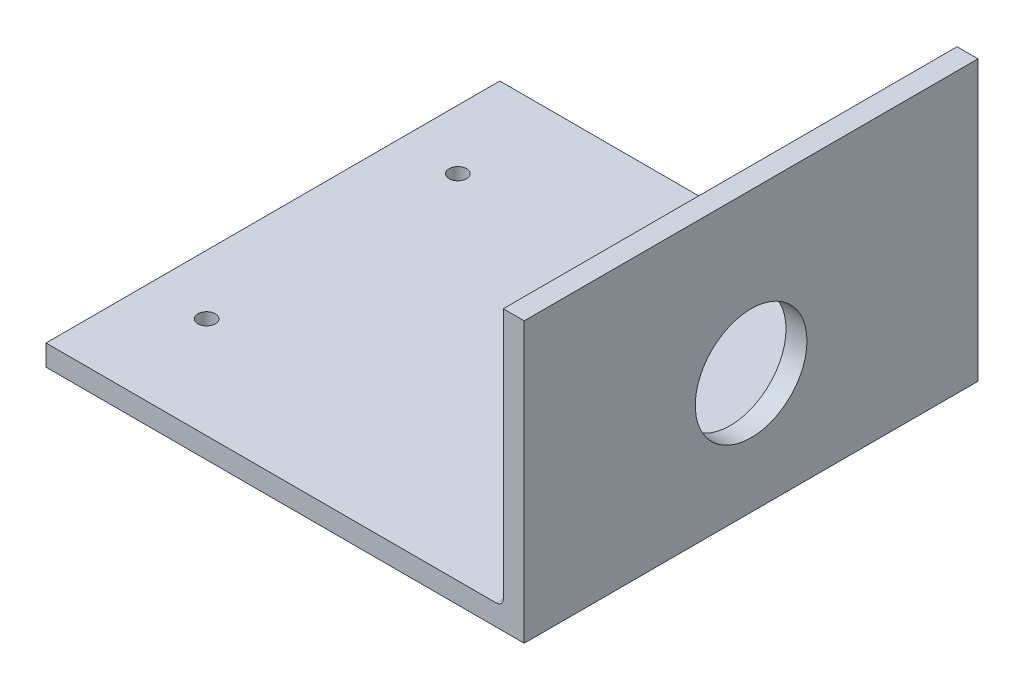
ISO-10303-21;
HEADER;
FILE_DESCRIPTION(('STEP AP214'),'2;1');
FILE_NAME('part.step','',(''),(''),'','','');
FILE_SCHEMA(('AUTOMOTIVE_DESIGN { 1 0 10303 214 1 1 1 1 }'));
ENDSEC;
DATA;
#1=APPLICATION_CONTEXT('core data for automotive mechanical design processes');
#2=APPLICATION_PROTOCOL_DEFINITION('international standard','automotive_design',2000,#1);
#3=PRODUCT_CONTEXT('',#1,'mechanical');
#4=PRODUCT('Part','Part','',(#3));
#5=PRODUCT_RELATED_PRODUCT_CATEGORY('part','',(#4));
#6=PRODUCT_DEFINITION_FORMATION('','',#4);
#7=PRODUCT_DEFINITION_CONTEXT('part definition',#1,'design');
#8=PRODUCT_DEFINITION('design','',#6,#7);
#9=PRODUCT_DEFINITION_SHAPE('','',#8);
#10=(LENGTH_UNIT() NAMED_UNIT(*) SI_UNIT(.MILLI.,.METRE.));
#11=(NAMED_UNIT(*) PLANE_ANGLE_UNIT() SI_UNIT($,.RADIAN.));
#12=(NAMED_UNIT(*) SI_UNIT($,.STERADIAN.) SOLID_ANGLE_UNIT());
#13=UNCERTAINTY_MEASURE_WITH_UNIT(LENGTH_MEASURE(1.E-05),#10,'distance_accuracy_value','');
#14=(GEOMETRIC_REPRESENTATION_CONTEXT(3) GLOBAL_UNCERTAINTY_ASSIGNED_CONTEXT((#13)) GLOBAL_UNIT_ASSIGNED_CONTEXT((#10,
#11,#12)) REPRESENTATION_CONTEXT('',''));
#15=CARTESIAN_POINT('',(0.,0.,0.));
#16=DIRECTION('',(0.,0.,1.));
#17=DIRECTION('',(1.,0.,0.));
#18=AXIS2_PLACEMENT_3D('',#15,#16,#17);
#19=CARTESIAN_POINT('',(0.,860.629465365196,0.));
#20=DIRECTION('',(0.,-1.,0.));
#21=DIRECTION('',(0.,0.,-1.));
#22=AXIS2_PLACEMENT_3D('',#19,#20,#21);
#23=PLANE('',#22);
#24=CARTESIAN_POINT('',(709.231990877992,860.629465365196,1291.3328662841));
#25=DIRECTION('',(0.,-1.,0.));
#26=DIRECTION('',(0.,0.,-1.));
#27=AXIS2_PLACEMENT_3D('',#24,#25,#26);
#28=CIRCLE('',#27,1.24999999999997);
#29=CARTESIAN_POINT('',(709.231990877992,860.629465365196,1290.0828662841));
#30=VERTEX_POINT('',#29);
#31=EDGE_CURVE('E148',#30,#30,#28,.T.);
#32=ORIENTED_EDGE('',*,*,#31,.F.);
#33=EDGE_LOOP('',(#32));
#34=FACE_BOUND('',#33,.T.);
#35=CARTESIAN_POINT('',(661.231990877992,860.629465365196,1327.3328662841));
#36=DIRECTION('',(0.,-1.,0.));
#37=DIRECTION('',(0.,0.,-1.));
#38=AXIS2_PLACEMENT_3D('',#35,#36,#37);
#39=CIRCLE('',#38,1.24999999999997);
#40=CARTESIAN_POINT('',(661.231990877992,860.629465365196,1326.0828662841));
#41=VERTEX_POINT('',#40);
#42=EDGE_CURVE('E164',#41,#41,#39,.T.);
#43=ORIENTED_EDGE('',*,*,#42,.F.);
#44=EDGE_LOOP('',(#43));
#45=FACE_BOUND('',#44,.T.);
#46=DIRECTION('',(1.,0.,0.));
#47=VECTOR('',#46,1.);
#48=CARTESIAN_POINT('',(652.731990877992,860.629465365196,1276.8328662841));
#49=LINE('',#48,#47);
#50=CARTESIAN_POINT('',(652.731990877992,860.629465365196,1276.8328662841));
#51=VERTEX_POINT('',#50);
#52=CARTESIAN_POINT('',(721.231990877992,860.629465365196,1276.8328662841));
#53=VERTEX_POINT('',#52);
#54=EDGE_CURVE('E179',#51,#53,#49,.T.);
#55=ORIENTED_EDGE('',*,*,#54,.T.);
#56=DIRECTION('',(0.,0.,-1.));
#57=VECTOR('',#56,1.);
#58=CARTESIAN_POINT('',(721.231990877992,860.629465365196,1381.98569930993));
#59=LINE('',#58,#57);
#60=CARTESIAN_POINT('',(721.231990877992,860.629465365196,1341.8328662841));
#61=VERTEX_POINT('',#60);
#62=EDGE_CURVE('E132',#61,#53,#59,.T.);
#63=ORIENTED_EDGE('',*,*,#62,.F.);
#64=DIRECTION('',(-1.,0.,0.));
#65=VECTOR('',#64,1.);
#66=CARTESIAN_POINT('',(652.731990877992,860.629465365196,1341.8328662841));
#67=LINE('',#66,#65);
#68=CARTESIAN_POINT('',(652.731990877992,860.629465365196,1341.8328662841));
#69=VERTEX_POINT('',#68);
#70=EDGE_CURVE('E172',#61,#69,#67,.T.);
#71=ORIENTED_EDGE('',*,*,#70,.T.);
#72=DIRECTION('',(0.,0.,-1.));
#73=VECTOR('',#72,1.);
#74=CARTESIAN_POINT('',(652.731990877992,860.629465365196,1341.8328662841));
#75=LINE('',#74,#73);
#76=EDGE_CURVE('E175',#69,#51,#75,.T.);
#77=ORIENTED_EDGE('',*,*,#76,.T.);
#78=EDGE_LOOP('',(#55,#63,#71,#77));
#79=FACE_BOUND('',#78,.T.);
#80=CARTESIAN_POINT('',(661.231990877992,860.629465365196,1291.3328662841));
#81=DIRECTION('',(0.,-1.,0.));
#82=DIRECTION('',(0.,0.,-1.));
#83=AXIS2_PLACEMENT_3D('',#80,#81,#82);
#84=CIRCLE('',#83,1.24999999999997);
#85=CARTESIAN_POINT('',(661.231990877992,860.629465365196,1290.0828662841));
#86=VERTEX_POINT('',#85);
#87=EDGE_CURVE('E156',#86,#86,#84,.T.);
#88=ORIENTED_EDGE('',*,*,#87,.F.);
#89=EDGE_LOOP('',(#88));
#90=FACE_BOUND('',#89,.T.);
#91=CARTESIAN_POINT('',(709.231990877992,860.629465365196,1327.3328662841));
#92=DIRECTION('',(0.,-1.,0.));
#93=DIRECTION('',(0.,0.,-1.));
#94=AXIS2_PLACEMENT_3D('',#91,#92,#93);
#95=CIRCLE('',#94,1.24999999999997);
#96=CARTESIAN_POINT('',(709.231990877992,860.629465365196,1326.0828662841));
#97=VERTEX_POINT('',#96);
#98=EDGE_CURVE('E138',#97,#97,#95,.T.);
#99=ORIENTED_EDGE('',*,*,#98,.F.);
#100=EDGE_LOOP('',(#99));
#101=FACE_BOUND('',#100,.T.);
#102=ADVANCED_FACE('F47',(#34,#45,#79,#90,#101),#23,.T.);
#103=CARTESIAN_POINT('',(0.,863.629465365196,0.));
#104=DIRECTION('',(0.,-1.,0.));
#105=DIRECTION('',(0.,0.,-1.));
#106=AXIS2_PLACEMENT_3D('',#103,#104,#105);
#107=PLANE('',#106);
#108=DIRECTION('',(-1.,0.,0.));
#109=VECTOR('',#108,1.);
#110=CARTESIAN_POINT('',(652.731990877992,863.629465365196,1341.8328662841));
#111=LINE('',#110,#109);
#112=CARTESIAN_POINT('',(717.231990877992,863.629465365196,1341.8328662841));
#113=VERTEX_POINT('',#112);
#114=CARTESIAN_POINT('',(652.731990877992,863.629465365196,1341.8328662841));
#115=VERTEX_POINT('',#114);
#116=EDGE_CURVE('E168',#113,#115,#111,.T.);
#117=ORIENTED_EDGE('',*,*,#116,.F.);
#118=DIRECTION('',(0.,0.,-1.));
#119=VECTOR('',#118,1.);
#120=CARTESIAN_POINT('',(717.231990877992,863.629465365196,0.));
#121=LINE('',#120,#119);
#122=CARTESIAN_POINT('',(717.231990877992,863.629465365196,1276.8328662841));
#123=VERTEX_POINT('',#122);
#124=EDGE_CURVE('E197',#113,#123,#121,.T.);
#125=ORIENTED_EDGE('',*,*,#124,.T.);
#126=DIRECTION('',(1.,0.,0.));
#127=VECTOR('',#126,1.);
#128=CARTESIAN_POINT('',(652.731990877992,863.629465365196,1276.8328662841));
#129=LINE('',#128,#127);
#130=CARTESIAN_POINT('',(652.731990877992,863.629465365196,1276.8328662841));
#131=VERTEX_POINT('',#130);
#132=EDGE_CURVE('E176',#131,#123,#129,.T.);
#133=ORIENTED_EDGE('',*,*,#132,.F.);
#134=DIRECTION('',(0.,0.,-1.));
#135=VECTOR('',#134,1.);
#136=CARTESIAN_POINT('',(652.731990877992,863.629465365196,1341.8328662841));
#137=LINE('',#136,#135);
#138=EDGE_CURVE('E185',#115,#131,#137,.T.);
#139=ORIENTED_EDGE('',*,*,#138,.F.);
#140=EDGE_LOOP('',(#117,#125,#133,#139));
#141=FACE_BOUND('',#140,.T.);
#142=CARTESIAN_POINT('',(661.231990877992,863.629465365196,1327.3328662841));
#143=DIRECTION('',(0.,-1.,0.));
#144=DIRECTION('',(0.,0.,-1.));
#145=AXIS2_PLACEMENT_3D('',#142,#143,#144);
#146=CIRCLE('',#145,1.24999999999997);
#147=CARTESIAN_POINT('',(661.231990877992,863.629465365196,1326.0828662841));
#148=VERTEX_POINT('',#147);
#149=EDGE_CURVE('E160',#148,#148,#146,.T.);
#150=ORIENTED_EDGE('',*,*,#149,.T.);
#151=EDGE_LOOP('',(#150));
#152=FACE_BOUND('',#151,.T.);
#153=CARTESIAN_POINT('',(661.231990877992,863.629465365196,1291.3328662841));
#154=DIRECTION('',(0.,-1.,0.));
#155=DIRECTION('',(0.,0.,-1.));
#156=AXIS2_PLACEMENT_3D('',#153,#154,#155);
#157=CIRCLE('',#156,1.24999999999997);
#158=CARTESIAN_POINT('',(661.231990877992,863.629465365196,1290.0828662841));
#159=VERTEX_POINT('',#158);
#160=EDGE_CURVE('E152',#159,#159,#157,.T.);
#161=ORIENTED_EDGE('',*,*,#160,.T.);
#162=EDGE_LOOP('',(#161));
#163=FACE_BOUND('',#162,.T.);
#164=CARTESIAN_POINT('',(709.231990877992,863.629465365196,1291.3328662841));
#165=DIRECTION('',(0.,-1.,0.));
#166=DIRECTION('',(0.,0.,-1.));
#167=AXIS2_PLACEMENT_3D('',#164,#165,#166);
#168=CIRCLE('',#167,1.24999999999997);
#169=CARTESIAN_POINT('',(709.231990877992,863.629465365196,1290.0828662841));
#170=VERTEX_POINT('',#169);
#171=EDGE_CURVE('E142',#170,#170,#168,.T.);
#172=ORIENTED_EDGE('',*,*,#171,.T.);
#173=EDGE_LOOP('',(#172));
#174=FACE_BOUND('',#173,.T.);
#175=CARTESIAN_POINT('',(709.231990877992,863.629465365196,1327.3328662841));
#176=DIRECTION('',(0.,-1.,0.));
#177=DIRECTION('',(0.,0.,-1.));
#178=AXIS2_PLACEMENT_3D('',#175,#176,#177);
#179=CIRCLE('',#178,1.24999999999997);
#180=CARTESIAN_POINT('',(709.231990877992,863.629465365196,1326.0828662841));
#181=VERTEX_POINT('',#180);
#182=EDGE_CURVE('E143',#181,#181,#179,.T.);
#183=ORIENTED_EDGE('',*,*,#182,.T.);
#184=EDGE_LOOP('',(#183));
#185=FACE_BOUND('',#184,.T.);
#186=ADVANCED_FACE('F240',(#141,#152,#163,#174,#185),#107,.F.);
#187=CARTESIAN_POINT('',(652.731990877992,860.629465365196,1341.8328662841));
#188=DIRECTION('',(0.,0.,-1.));
#189=DIRECTION('',(-1.,0.,0.));
#190=AXIS2_PLACEMENT_3D('',#187,#188,#189);
#191=PLANE('',#190);
#192=DIRECTION('',(0.,-1.,0.));
#193=VECTOR('',#192,1.);
#194=CARTESIAN_POINT('',(718.231990877992,863.629465365196,1341.8328662841));
#195=LINE('',#194,#193);
#196=CARTESIAN_POINT('',(718.231990877992,900.629465365196,1341.8328662841));
#197=VERTEX_POINT('',#196);
#198=CARTESIAN_POINT('',(718.231990877992,864.629465365196,1341.8328662841));
#199=VERTEX_POINT('',#198);
#200=EDGE_CURVE('E117',#197,#199,#195,.T.);
#201=ORIENTED_EDGE('',*,*,#200,.T.);
#202=CARTESIAN_POINT('',(717.231990877992,864.629465365196,1341.8328662841));
#203=DIRECTION('',(0.,0.,-1.));
#204=DIRECTION('',(-1.,0.,0.));
#205=AXIS2_PLACEMENT_3D('',#202,#203,#204);
#206=CIRCLE('',#205,1.);
#207=EDGE_CURVE('E11',#199,#113,#206,.T.);
#208=ORIENTED_EDGE('',*,*,#207,.T.);
#209=ORIENTED_EDGE('',*,*,#116,.T.);
#210=DIRECTION('',(0.,1.,0.));
#211=VECTOR('',#210,1.);
#212=CARTESIAN_POINT('',(652.731990877992,860.629465365196,1341.8328662841));
#213=LINE('',#212,#211);
#214=EDGE_CURVE('E193',#69,#115,#213,.T.);
#215=ORIENTED_EDGE('',*,*,#214,.F.);
#216=ORIENTED_EDGE('',*,*,#70,.F.);
#217=DIRECTION('',(0.,1.,0.));
#218=VECTOR('',#217,1.);
#219=CARTESIAN_POINT('',(721.231990877992,900.629465365196,1341.8328662841));
#220=LINE('',#219,#218);
#221=CARTESIAN_POINT('',(721.231990877992,900.629465365196,1341.8328662841));
#222=VERTEX_POINT('',#221);
#223=EDGE_CURVE('E147',#61,#222,#220,.T.);
#224=ORIENTED_EDGE('',*,*,#223,.T.);
#225=DIRECTION('',(-1.,0.,0.));
#226=VECTOR('',#225,1.);
#227=CARTESIAN_POINT('',(718.231990877992,900.629465365196,1341.8328662841));
#228=LINE('',#227,#226);
#229=EDGE_CURVE('E205',#222,#197,#228,.T.);
#230=ORIENTED_EDGE('',*,*,#229,.T.);
#231=EDGE_LOOP('',(#201,#208,#209,#215,#216,#224,#230));
#232=FACE_BOUND('',#231,.T.);
#233=ADVANCED_FACE('F244',(#232),#191,.F.);
#234=CARTESIAN_POINT('',(652.731990877992,860.629465365196,1341.8328662841));
#235=DIRECTION('',(1.,0.,0.));
#236=DIRECTION('',(0.,0.,-1.));
#237=AXIS2_PLACEMENT_3D('',#234,#235,#236);
#238=PLANE('',#237);
#239=ORIENTED_EDGE('',*,*,#138,.T.);
#240=DIRECTION('',(0.,1.,0.));
#241=VECTOR('',#240,1.);
#242=CARTESIAN_POINT('',(652.731990877992,860.629465365196,1276.8328662841));
#243=LINE('',#242,#241);
#244=EDGE_CURVE('E182',#51,#131,#243,.T.);
#245=ORIENTED_EDGE('',*,*,#244,.F.);
#246=ORIENTED_EDGE('',*,*,#76,.F.);
#247=ORIENTED_EDGE('',*,*,#214,.T.);
#248=EDGE_LOOP('',(#239,#245,#246,#247));
#249=FACE_BOUND('',#248,.T.);
#250=ADVANCED_FACE('F245',(#249),#238,.F.);
#251=CARTESIAN_POINT('',(652.731990877992,860.629465365196,1276.8328662841));
#252=DIRECTION('',(0.,0.,1.));
#253=DIRECTION('',(1.,0.,0.));
#254=AXIS2_PLACEMENT_3D('',#251,#252,#253);
#255=PLANE('',#254);
#256=ORIENTED_EDGE('',*,*,#132,.T.);
#257=CARTESIAN_POINT('',(717.231990877992,864.629465365196,1276.8328662841));
#258=DIRECTION('',(0.,0.,1.));
#259=DIRECTION('',(1.,0.,0.));
#260=AXIS2_PLACEMENT_3D('',#257,#258,#259);
#261=CIRCLE('',#260,1.);
#262=CARTESIAN_POINT('',(718.231990877992,864.629465365196,1276.8328662841));
#263=VERTEX_POINT('',#262);
#264=EDGE_CURVE('E56',#123,#263,#261,.T.);
#265=ORIENTED_EDGE('',*,*,#264,.T.);
#266=DIRECTION('',(0.,1.,0.));
#267=VECTOR('',#266,1.);
#268=CARTESIAN_POINT('',(718.231990877992,863.629465365196,1276.8328662841));
#269=LINE('',#268,#267);
#270=CARTESIAN_POINT('',(718.231990877992,900.629465365196,1276.8328662841));
#271=VERTEX_POINT('',#270);
#272=EDGE_CURVE('E104',#263,#271,#269,.T.);
#273=ORIENTED_EDGE('',*,*,#272,.T.);
#274=DIRECTION('',(1.,0.,0.));
#275=VECTOR('',#274,1.);
#276=CARTESIAN_POINT('',(718.231990877992,900.629465365196,1276.8328662841));
#277=LINE('',#276,#275);
#278=CARTESIAN_POINT('',(721.231990877992,900.629465365196,1276.8328662841));
#279=VERTEX_POINT('',#278);
#280=EDGE_CURVE('E109',#271,#279,#277,.T.);
#281=ORIENTED_EDGE('',*,*,#280,.T.);
#282=DIRECTION('',(0.,-1.,0.));
#283=VECTOR('',#282,1.);
#284=CARTESIAN_POINT('',(721.231990877992,900.629465365196,1276.8328662841));
#285=LINE('',#284,#283);
#286=EDGE_CURVE('E122',#279,#53,#285,.T.);
#287=ORIENTED_EDGE('',*,*,#286,.T.);
#288=ORIENTED_EDGE('',*,*,#54,.F.);
#289=ORIENTED_EDGE('',*,*,#244,.T.);
#290=EDGE_LOOP('',(#256,#265,#273,#281,#287,#288,#289));
#291=FACE_BOUND('',#290,.T.);
#292=ADVANCED_FACE('F106',(#291),#255,.F.);
#293=CARTESIAN_POINT('',(661.231990877992,860.629465365196,1327.3328662841));
#294=DIRECTION('',(0.,1.,0.));
#295=DIRECTION('',(0.,0.,1.));
#296=AXIS2_PLACEMENT_3D('',#293,#294,#295);
#297=CYLINDRICAL_SURFACE('',#296,1.24999999999997);
#298=ORIENTED_EDGE('',*,*,#149,.F.);
#299=EDGE_LOOP('',(#298));
#300=FACE_BOUND('',#299,.T.);
#301=ORIENTED_EDGE('',*,*,#42,.T.);
#302=EDGE_LOOP('',(#301));
#303=FACE_BOUND('',#302,.T.);
#304=ADVANCED_FACE('F252',(#300,#303),#297,.F.);
#305=CARTESIAN_POINT('',(661.231990877992,860.629465365196,1291.3328662841));
#306=DIRECTION('',(0.,1.,0.));
#307=DIRECTION('',(0.,0.,1.));
#308=AXIS2_PLACEMENT_3D('',#305,#306,#307);
#309=CYLINDRICAL_SURFACE('',#308,1.24999999999997);
#310=ORIENTED_EDGE('',*,*,#160,.F.);
#311=EDGE_LOOP('',(#310));
#312=FACE_BOUND('',#311,.T.);
#313=ORIENTED_EDGE('',*,*,#87,.T.);
#314=EDGE_LOOP('',(#313));
#315=FACE_BOUND('',#314,.T.);
#316=ADVANCED_FACE('F268',(#312,#315),#309,.F.);
#317=CARTESIAN_POINT('',(709.231990877992,860.629465365196,1291.3328662841));
#318=DIRECTION('',(0.,1.,0.));
#319=DIRECTION('',(0.,0.,1.));
#320=AXIS2_PLACEMENT_3D('',#317,#318,#319);
#321=CYLINDRICAL_SURFACE('',#320,1.24999999999997);
#322=ORIENTED_EDGE('',*,*,#171,.F.);
#323=EDGE_LOOP('',(#322));
#324=FACE_BOUND('',#323,.T.);
#325=ORIENTED_EDGE('',*,*,#31,.T.);
#326=EDGE_LOOP('',(#325));
#327=FACE_BOUND('',#326,.T.);
#328=ADVANCED_FACE('F272',(#324,#327),#321,.F.);
#329=CARTESIAN_POINT('',(709.231990877992,860.629465365196,1327.3328662841));
#330=DIRECTION('',(0.,1.,0.));
#331=DIRECTION('',(0.,0.,1.));
#332=AXIS2_PLACEMENT_3D('',#329,#330,#331);
#333=CYLINDRICAL_SURFACE('',#332,1.24999999999997);
#334=ORIENTED_EDGE('',*,*,#182,.F.);
#335=EDGE_LOOP('',(#334));
#336=FACE_BOUND('',#335,.T.);
#337=ORIENTED_EDGE('',*,*,#98,.T.);
#338=EDGE_LOOP('',(#337));
#339=FACE_BOUND('',#338,.T.);
#340=ADVANCED_FACE('F225',(#336,#339),#333,.F.);
#341=CARTESIAN_POINT('',(721.231990877992,900.629465365196,1381.98569930993));
#342=DIRECTION('',(1.,0.,0.));
#343=DIRECTION('',(0.,0.,-1.));
#344=AXIS2_PLACEMENT_3D('',#341,#342,#343);
#345=PLANE('',#344);
#346=CARTESIAN_POINT('',(721.231990877992,877.879465365196,1309.3328662841));
#347=DIRECTION('',(1.,0.,0.));
#348=DIRECTION('',(0.,0.,-1.));
#349=AXIS2_PLACEMENT_3D('',#346,#347,#348);
#350=CIRCLE('',#349,7.99999999999999);
#351=CARTESIAN_POINT('',(721.231990877992,877.879465365196,1301.3328662841));
#352=VERTEX_POINT('',#351);
#353=EDGE_CURVE('E112',#352,#352,#350,.T.);
#354=ORIENTED_EDGE('',*,*,#353,.F.);
#355=EDGE_LOOP('',(#354));
#356=FACE_BOUND('',#355,.T.);
#357=ORIENTED_EDGE('',*,*,#223,.F.);
#358=ORIENTED_EDGE('',*,*,#62,.T.);
#359=ORIENTED_EDGE('',*,*,#286,.F.);
#360=DIRECTION('',(0.,0.,-1.));
#361=VECTOR('',#360,1.);
#362=CARTESIAN_POINT('',(721.231990877992,900.629465365196,1381.98569930993));
#363=LINE('',#362,#361);
#364=EDGE_CURVE('E121',#222,#279,#363,.T.);
#365=ORIENTED_EDGE('',*,*,#364,.F.);
#366=EDGE_LOOP('',(#357,#358,#359,#365));
#367=FACE_BOUND('',#366,.T.);
#368=ADVANCED_FACE('F222',(#356,#367),#345,.T.);
#369=CARTESIAN_POINT('',(718.231990877992,900.629465365196,1381.98569930993));
#370=DIRECTION('',(0.,1.,0.));
#371=DIRECTION('',(0.,0.,1.));
#372=AXIS2_PLACEMENT_3D('',#369,#370,#371);
#373=PLANE('',#372);
#374=ORIENTED_EDGE('',*,*,#229,.F.);
#375=ORIENTED_EDGE('',*,*,#364,.T.);
#376=ORIENTED_EDGE('',*,*,#280,.F.);
#377=DIRECTION('',(0.,0.,-1.));
#378=VECTOR('',#377,1.);
#379=CARTESIAN_POINT('',(718.231990877992,900.629465365196,1381.98569930993));
#380=LINE('',#379,#378);
#381=EDGE_CURVE('E115',#197,#271,#380,.T.);
#382=ORIENTED_EDGE('',*,*,#381,.F.);
#383=EDGE_LOOP('',(#374,#375,#376,#382));
#384=FACE_BOUND('',#383,.T.);
#385=ADVANCED_FACE('F124',(#384),#373,.T.);
#386=CARTESIAN_POINT('',(718.231990877992,863.629465365196,1381.98569930993));
#387=DIRECTION('',(-1.,0.,0.));
#388=DIRECTION('',(0.,0.,1.));
#389=AXIS2_PLACEMENT_3D('',#386,#387,#388);
#390=PLANE('',#389);
#391=CARTESIAN_POINT('',(718.231990877992,877.879465365196,1309.3328662841));
#392=DIRECTION('',(-1.,0.,0.));
#393=DIRECTION('',(0.,0.,1.));
#394=AXIS2_PLACEMENT_3D('',#391,#392,#393);
#395=CIRCLE('',#394,7.99999999999999);
#396=CARTESIAN_POINT('',(718.231990877992,877.879465365196,1317.3328662841));
#397=VERTEX_POINT('',#396);
#398=EDGE_CURVE('E212',#397,#397,#395,.F.);
#399=ORIENTED_EDGE('',*,*,#398,.T.);
#400=EDGE_LOOP('',(#399));
#401=FACE_BOUND('',#400,.T.);
#402=ORIENTED_EDGE('',*,*,#272,.F.);
#403=DIRECTION('',(0.,0.,-1.));
#404=VECTOR('',#403,1.);
#405=CARTESIAN_POINT('',(718.231990877992,864.629465365196,1381.98569930993));
#406=LINE('',#405,#404);
#407=EDGE_CURVE('E69',#263,#199,#406,.F.);
#408=ORIENTED_EDGE('',*,*,#407,.T.);
#409=ORIENTED_EDGE('',*,*,#200,.F.);
#410=ORIENTED_EDGE('',*,*,#381,.T.);
#411=EDGE_LOOP('',(#402,#408,#409,#410));
#412=FACE_BOUND('',#411,.T.);
#413=ADVANCED_FACE('F116',(#401,#412),#390,.T.);
#414=CARTESIAN_POINT('',(652.730990877992,877.879465365196,1309.3328662841));
#415=DIRECTION('',(1.,0.,0.));
#416=DIRECTION('',(0.,0.,-1.));
#417=AXIS2_PLACEMENT_3D('',#414,#415,#416);
#418=CYLINDRICAL_SURFACE('',#417,7.99999999999999);
#419=ORIENTED_EDGE('',*,*,#398,.F.);
#420=EDGE_LOOP('',(#419));
#421=FACE_BOUND('',#420,.T.);
#422=ORIENTED_EDGE('',*,*,#353,.T.);
#423=EDGE_LOOP('',(#422));
#424=FACE_BOUND('',#423,.T.);
#425=ADVANCED_FACE('F220',(#421,#424),#418,.F.);
#426=CARTESIAN_POINT('',(717.231990877992,864.629465365196,0.));
#427=DIRECTION('',(0.,0.,-1.));
#428=DIRECTION('',(-1.,0.,0.));
#429=AXIS2_PLACEMENT_3D('',#426,#427,#428);
#430=CYLINDRICAL_SURFACE('',#429,1.);
#431=ORIENTED_EDGE('',*,*,#207,.F.);
#432=ORIENTED_EDGE('',*,*,#407,.F.);
#433=ORIENTED_EDGE('',*,*,#264,.F.);
#434=ORIENTED_EDGE('',*,*,#124,.F.);
#435=EDGE_LOOP('',(#431,#432,#433,#434));
#436=FACE_BOUND('',#435,.T.);
#437=ADVANCED_FACE('F49',(#436),#430,.F.);
#438=CLOSED_SHELL('',(#102,#186,#233,#250,#292,#304,#316,#328,#340,#368,#385,#413,#425,#437));
#439=MANIFOLD_SOLID_BREP('B2',#438);
#440=ADVANCED_BREP_SHAPE_REPRESENTATION('',(#18,#439),#14);
#441=SHAPE_DEFINITION_REPRESENTATION(#9,#440);
ENDSEC;
END-ISO-10303-21;
